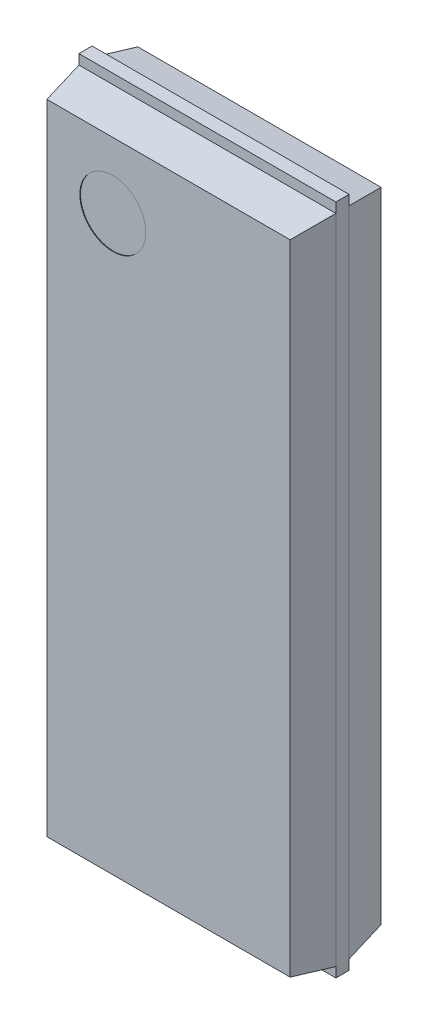
ISO-10303-21;
HEADER;
FILE_DESCRIPTION(('STEP AP214'),'2;1');
FILE_NAME('part.step','',(''),(''),'','','');
FILE_SCHEMA(('AUTOMOTIVE_DESIGN { 1 0 10303 214 1 1 1 1 }'));
ENDSEC;
DATA;
#1=APPLICATION_CONTEXT('core data for automotive mechanical design processes');
#2=APPLICATION_PROTOCOL_DEFINITION('international standard','automotive_design',2000,#1);
#3=PRODUCT_CONTEXT('',#1,'mechanical');
#4=PRODUCT('Part','Part','',(#3));
#5=PRODUCT_RELATED_PRODUCT_CATEGORY('part','',(#4));
#6=PRODUCT_DEFINITION_FORMATION('','',#4);
#7=PRODUCT_DEFINITION_CONTEXT('part definition',#1,'design');
#8=PRODUCT_DEFINITION('design','',#6,#7);
#9=PRODUCT_DEFINITION_SHAPE('','',#8);
#10=(LENGTH_UNIT() NAMED_UNIT(*) SI_UNIT(.MILLI.,.METRE.));
#11=(NAMED_UNIT(*) PLANE_ANGLE_UNIT() SI_UNIT($,.RADIAN.));
#12=(NAMED_UNIT(*) SI_UNIT($,.STERADIAN.) SOLID_ANGLE_UNIT());
#13=UNCERTAINTY_MEASURE_WITH_UNIT(LENGTH_MEASURE(1.E-05),#10,'distance_accuracy_value','');
#14=(GEOMETRIC_REPRESENTATION_CONTEXT(3) GLOBAL_UNCERTAINTY_ASSIGNED_CONTEXT((#13)) GLOBAL_UNIT_ASSIGNED_CONTEXT((#10,
#11,#12)) REPRESENTATION_CONTEXT('',''));
#15=CARTESIAN_POINT('',(0.,0.,0.));
#16=DIRECTION('',(0.,0.,1.));
#17=DIRECTION('',(1.,0.,0.));
#18=AXIS2_PLACEMENT_3D('',#15,#16,#17);
#19=CARTESIAN_POINT('',(1.95,-5.1,0.77));
#20=DIRECTION('',(0.,-1.,0.));
#21=DIRECTION('',(0.,0.,-1.));
#22=AXIS2_PLACEMENT_3D('',#19,#20,#21);
#23=PLANE('',#22);
#24=DIRECTION('',(0.,0.,1.));
#25=VECTOR('',#24,1.);
#26=CARTESIAN_POINT('',(-1.95,-5.1,0.77));
#27=LINE('',#26,#25);
#28=CARTESIAN_POINT('',(-1.95,-5.1,0.77));
#29=VERTEX_POINT('',#28);
#30=CARTESIAN_POINT('',(-1.95,-5.1,0.97));
#31=VERTEX_POINT('',#30);
#32=EDGE_CURVE('E196',#29,#31,#27,.T.);
#33=ORIENTED_EDGE('',*,*,#32,.F.);
#34=DIRECTION('',(-1.,0.,0.));
#35=VECTOR('',#34,1.);
#36=CARTESIAN_POINT('',(1.95,-5.1,0.77));
#37=LINE('',#36,#35);
#38=CARTESIAN_POINT('',(1.95,-5.1,0.77));
#39=VERTEX_POINT('',#38);
#40=EDGE_CURVE('E26',#39,#29,#37,.T.);
#41=ORIENTED_EDGE('',*,*,#40,.F.);
#42=DIRECTION('',(0.,0.,1.));
#43=VECTOR('',#42,1.);
#44=CARTESIAN_POINT('',(1.95,-5.1,0.77));
#45=LINE('',#44,#43);
#46=CARTESIAN_POINT('',(1.95,-5.1,0.97));
#47=VERTEX_POINT('',#46);
#48=EDGE_CURVE('E265',#39,#47,#45,.T.);
#49=ORIENTED_EDGE('',*,*,#48,.T.);
#50=DIRECTION('',(-1.,0.,0.));
#51=VECTOR('',#50,1.);
#52=CARTESIAN_POINT('',(1.95,-5.1,0.97));
#53=LINE('',#52,#51);
#54=EDGE_CURVE('E11',#47,#31,#53,.T.);
#55=ORIENTED_EDGE('',*,*,#54,.T.);
#56=EDGE_LOOP('',(#33,#41,#49,#55));
#57=FACE_BOUND('',#56,.T.);
#58=ADVANCED_FACE('F16',(#57),#23,.T.);
#59=CARTESIAN_POINT('',(1.95,-5.1,0.97));
#60=DIRECTION('',(0.,0.,1.));
#61=DIRECTION('',(1.,0.,0.));
#62=AXIS2_PLACEMENT_3D('',#59,#60,#61);
#63=PLANE('',#62);
#64=DIRECTION('',(0.,1.,0.));
#65=VECTOR('',#64,1.);
#66=CARTESIAN_POINT('',(-1.95,-5.1,0.97));
#67=LINE('',#66,#65);
#68=CARTESIAN_POINT('',(-1.95,-4.95,0.97));
#69=VERTEX_POINT('',#68);
#70=EDGE_CURVE('E168',#31,#69,#67,.T.);
#71=ORIENTED_EDGE('',*,*,#70,.F.);
#72=ORIENTED_EDGE('',*,*,#54,.F.);
#73=DIRECTION('',(0.,1.,0.));
#74=VECTOR('',#73,1.);
#75=CARTESIAN_POINT('',(1.95,-5.1,0.97));
#76=LINE('',#75,#74);
#77=CARTESIAN_POINT('',(1.95,-4.95,0.97));
#78=VERTEX_POINT('',#77);
#79=EDGE_CURVE('E171',#47,#78,#76,.T.);
#80=ORIENTED_EDGE('',*,*,#79,.T.);
#81=DIRECTION('',(-1.,0.,0.));
#82=VECTOR('',#81,1.);
#83=CARTESIAN_POINT('',(-1.95,-4.95,0.97));
#84=LINE('',#83,#82);
#85=EDGE_CURVE('E164',#78,#69,#84,.T.);
#86=ORIENTED_EDGE('',*,*,#85,.T.);
#87=EDGE_LOOP('',(#71,#72,#80,#86));
#88=FACE_BOUND('',#87,.T.);
#89=ADVANCED_FACE('F166',(#88),#63,.T.);
#90=CARTESIAN_POINT('',(1.95,-5.1,0.77));
#91=DIRECTION('',(0.,0.,1.));
#92=DIRECTION('',(1.,0.,0.));
#93=AXIS2_PLACEMENT_3D('',#90,#91,#92);
#94=PLANE('',#93);
#95=DIRECTION('',(0.,1.,0.));
#96=VECTOR('',#95,1.);
#97=CARTESIAN_POINT('',(-1.95,-5.1,0.77));
#98=LINE('',#97,#96);
#99=CARTESIAN_POINT('',(-1.95,-4.95,0.77));
#100=VERTEX_POINT('',#99);
#101=EDGE_CURVE('E287',#29,#100,#98,.T.);
#102=ORIENTED_EDGE('',*,*,#101,.T.);
#103=DIRECTION('',(1.,0.,0.));
#104=VECTOR('',#103,1.);
#105=CARTESIAN_POINT('',(1.95,-4.95,0.77));
#106=LINE('',#105,#104);
#107=CARTESIAN_POINT('',(1.95,-4.95,0.77));
#108=VERTEX_POINT('',#107);
#109=EDGE_CURVE('E221',#100,#108,#106,.T.);
#110=ORIENTED_EDGE('',*,*,#109,.T.);
#111=DIRECTION('',(0.,1.,0.));
#112=VECTOR('',#111,1.);
#113=CARTESIAN_POINT('',(1.95,-5.1,0.77));
#114=LINE('',#113,#112);
#115=EDGE_CURVE('E217',#39,#108,#114,.T.);
#116=ORIENTED_EDGE('',*,*,#115,.F.);
#117=ORIENTED_EDGE('',*,*,#40,.T.);
#118=EDGE_LOOP('',(#102,#110,#116,#117));
#119=FACE_BOUND('',#118,.T.);
#120=ADVANCED_FACE('F334',(#119),#94,.F.);
#121=CARTESIAN_POINT('',(1.95,5.1,0.97));
#122=DIRECTION('',(0.,0.,-1.));
#123=DIRECTION('',(0.,-1.,0.));
#124=AXIS2_PLACEMENT_3D('',#121,#122,#123);
#125=PLANE('',#124);
#126=DIRECTION('',(0.,-1.,0.));
#127=VECTOR('',#126,1.);
#128=CARTESIAN_POINT('',(-1.95,5.1,0.97));
#129=LINE('',#128,#127);
#130=CARTESIAN_POINT('',(-1.95,5.1,0.97));
#131=VERTEX_POINT('',#130);
#132=CARTESIAN_POINT('',(-1.95,4.95,0.97));
#133=VERTEX_POINT('',#132);
#134=EDGE_CURVE('E205',#131,#133,#129,.T.);
#135=ORIENTED_EDGE('',*,*,#134,.T.);
#136=DIRECTION('',(1.,0.,0.));
#137=VECTOR('',#136,1.);
#138=CARTESIAN_POINT('',(1.95,4.95,0.97));
#139=LINE('',#138,#137);
#140=CARTESIAN_POINT('',(1.95,4.95,0.97));
#141=VERTEX_POINT('',#140);
#142=EDGE_CURVE('E235',#133,#141,#139,.T.);
#143=ORIENTED_EDGE('',*,*,#142,.T.);
#144=DIRECTION('',(0.,-1.,0.));
#145=VECTOR('',#144,1.);
#146=CARTESIAN_POINT('',(1.95,5.1,0.97));
#147=LINE('',#146,#145);
#148=CARTESIAN_POINT('',(1.95,5.1,0.97));
#149=VERTEX_POINT('',#148);
#150=EDGE_CURVE('E243',#149,#141,#147,.T.);
#151=ORIENTED_EDGE('',*,*,#150,.F.);
#152=DIRECTION('',(-1.,0.,0.));
#153=VECTOR('',#152,1.);
#154=CARTESIAN_POINT('',(1.95,5.1,0.97));
#155=LINE('',#154,#153);
#156=EDGE_CURVE('E234',#149,#131,#155,.T.);
#157=ORIENTED_EDGE('',*,*,#156,.T.);
#158=EDGE_LOOP('',(#135,#143,#151,#157));
#159=FACE_BOUND('',#158,.T.);
#160=ADVANCED_FACE('F366',(#159),#125,.F.);
#161=CARTESIAN_POINT('',(1.95,5.1,0.77));
#162=DIRECTION('',(0.,-1.,0.));
#163=DIRECTION('',(0.,0.,-1.));
#164=AXIS2_PLACEMENT_3D('',#161,#162,#163);
#165=PLANE('',#164);
#166=DIRECTION('',(0.,0.,1.));
#167=VECTOR('',#166,1.);
#168=CARTESIAN_POINT('',(-1.95,5.1,0.77));
#169=LINE('',#168,#167);
#170=CARTESIAN_POINT('',(-1.95,5.1,0.77));
#171=VERTEX_POINT('',#170);
#172=EDGE_CURVE('E212',#171,#131,#169,.T.);
#173=ORIENTED_EDGE('',*,*,#172,.T.);
#174=ORIENTED_EDGE('',*,*,#156,.F.);
#175=DIRECTION('',(0.,0.,1.));
#176=VECTOR('',#175,1.);
#177=CARTESIAN_POINT('',(1.95,5.1,0.77));
#178=LINE('',#177,#176);
#179=CARTESIAN_POINT('',(1.95,5.1,0.77));
#180=VERTEX_POINT('',#179);
#181=EDGE_CURVE('E248',#180,#149,#178,.T.);
#182=ORIENTED_EDGE('',*,*,#181,.F.);
#183=DIRECTION('',(-1.,0.,0.));
#184=VECTOR('',#183,1.);
#185=CARTESIAN_POINT('',(1.95,5.1,0.77));
#186=LINE('',#185,#184);
#187=EDGE_CURVE('E113',#180,#171,#186,.T.);
#188=ORIENTED_EDGE('',*,*,#187,.T.);
#189=EDGE_LOOP('',(#173,#174,#182,#188));
#190=FACE_BOUND('',#189,.T.);
#191=ADVANCED_FACE('F421',(#190),#165,.F.);
#192=CARTESIAN_POINT('',(1.95,5.1,0.77));
#193=DIRECTION('',(0.,0.,-1.));
#194=DIRECTION('',(0.,-1.,0.));
#195=AXIS2_PLACEMENT_3D('',#192,#193,#194);
#196=PLANE('',#195);
#197=DIRECTION('',(0.,-1.,0.));
#198=VECTOR('',#197,1.);
#199=CARTESIAN_POINT('',(-1.95,5.1,0.77));
#200=LINE('',#199,#198);
#201=CARTESIAN_POINT('',(-1.95,4.95,0.77));
#202=VERTEX_POINT('',#201);
#203=EDGE_CURVE('E231',#171,#202,#200,.T.);
#204=ORIENTED_EDGE('',*,*,#203,.F.);
#205=ORIENTED_EDGE('',*,*,#187,.F.);
#206=DIRECTION('',(0.,-1.,0.));
#207=VECTOR('',#206,1.);
#208=CARTESIAN_POINT('',(1.95,5.1,0.77));
#209=LINE('',#208,#207);
#210=CARTESIAN_POINT('',(1.95,4.95,0.77));
#211=VERTEX_POINT('',#210);
#212=EDGE_CURVE('E271',#180,#211,#209,.T.);
#213=ORIENTED_EDGE('',*,*,#212,.T.);
#214=DIRECTION('',(-1.,0.,0.));
#215=VECTOR('',#214,1.);
#216=CARTESIAN_POINT('',(1.95,4.95,0.77));
#217=LINE('',#216,#215);
#218=EDGE_CURVE('E122',#211,#202,#217,.T.);
#219=ORIENTED_EDGE('',*,*,#218,.T.);
#220=EDGE_LOOP('',(#204,#205,#213,#219));
#221=FACE_BOUND('',#220,.T.);
#222=ADVANCED_FACE('F346',(#221),#196,.T.);
#223=CARTESIAN_POINT('',(-0.845967081382,3.845967081382,1.55));
#224=DIRECTION('',(0.,0.,1.));
#225=DIRECTION('',(1.,0.,0.));
#226=AXIS2_PLACEMENT_3D('',#223,#224,#225);
#227=PLANE('',#226);
#228=CARTESIAN_POINT('',(-0.845967081382,3.845967081382,1.55));
#229=DIRECTION('',(0.,0.,1.));
#230=DIRECTION('',(0.,-1.,0.));
#231=AXIS2_PLACEMENT_3D('',#228,#229,#230);
#232=CIRCLE('',#231,0.5);
#233=CARTESIAN_POINT('',(-0.845967081382,3.345967081382,1.55));
#234=VERTEX_POINT('',#233);
#235=CARTESIAN_POINT('',(-0.845967081382,4.345967081382,1.55));
#236=VERTEX_POINT('',#235);
#237=EDGE_CURVE('E236',#234,#236,#232,.T.);
#238=ORIENTED_EDGE('',*,*,#237,.T.);
#239=CARTESIAN_POINT('',(-0.845967081382,3.845967081382,1.55));
#240=DIRECTION('',(0.,0.,1.));
#241=DIRECTION('',(0.,-1.,0.));
#242=AXIS2_PLACEMENT_3D('',#239,#240,#241);
#243=CIRCLE('',#242,0.5);
#244=EDGE_CURVE('E143',#236,#234,#243,.T.);
#245=ORIENTED_EDGE('',*,*,#244,.T.);
#246=EDGE_LOOP('',(#238,#245));
#247=FACE_BOUND('',#246,.T.);
#248=ADVANCED_FACE('F400',(#247),#227,.T.);
#249=CARTESIAN_POINT('',(0.,4.845967081382,1.56));
#250=DIRECTION('',(0.,0.98480775301219,0.173648177667033));
#251=DIRECTION('',(1.,0.,0.));
#252=AXIS2_PLACEMENT_3D('',#249,#250,#251);
#253=PLANE('',#252);
#254=DIRECTION('',(0.171087869745971,0.171087869745971,-0.970287525247837));
#255=VECTOR('',#254,1.);
#256=CARTESIAN_POINT('',(1.704120492186,4.704120492186,2.364451982479));
#257=LINE('',#256,#255);
#258=CARTESIAN_POINT('',(1.845967081382,4.845967081382,1.56));
#259=VERTEX_POINT('',#258);
#260=EDGE_CURVE('E242',#259,#141,#257,.T.);
#261=ORIENTED_EDGE('',*,*,#260,.T.);
#262=ORIENTED_EDGE('',*,*,#142,.F.);
#263=DIRECTION('',(0.171087869745971,-0.171087869745971,0.970287525247837));
#264=VECTOR('',#263,1.);
#265=CARTESIAN_POINT('',(-1.704120492186,4.704120492186,2.364451982479));
#266=LINE('',#265,#264);
#267=CARTESIAN_POINT('',(-1.845967081382,4.845967081382,1.56));
#268=VERTEX_POINT('',#267);
#269=EDGE_CURVE('E202',#133,#268,#266,.T.);
#270=ORIENTED_EDGE('',*,*,#269,.T.);
#271=DIRECTION('',(-1.,0.,0.));
#272=VECTOR('',#271,1.);
#273=CARTESIAN_POINT('',(-1.95,4.845967081382,1.56));
#274=LINE('',#273,#272);
#275=EDGE_CURVE('E281',#259,#268,#274,.T.);
#276=ORIENTED_EDGE('',*,*,#275,.F.);
#277=EDGE_LOOP('',(#261,#262,#270,#276));
#278=FACE_BOUND('',#277,.T.);
#279=ADVANCED_FACE('F369',(#278),#253,.T.);
#280=CARTESIAN_POINT('',(-1.845967081382,0.,1.56));
#281=DIRECTION('',(-0.98480775301219,0.,0.173648177667033));
#282=DIRECTION('',(0.,1.,0.));
#283=AXIS2_PLACEMENT_3D('',#280,#281,#282);
#284=PLANE('',#283);
#285=DIRECTION('',(0.171087869745971,0.171087869745971,0.970287525247837));
#286=VECTOR('',#285,1.);
#287=CARTESIAN_POINT('',(-1.791933669709,-4.791933669709,1.866438705272));
#288=LINE('',#287,#286);
#289=CARTESIAN_POINT('',(-1.845967081382,-4.845967081382,1.56));
#290=VERTEX_POINT('',#289);
#291=EDGE_CURVE('E176',#69,#290,#288,.T.);
#292=ORIENTED_EDGE('',*,*,#291,.T.);
#293=DIRECTION('',(0.,-1.,0.));
#294=VECTOR('',#293,1.);
#295=CARTESIAN_POINT('',(-1.845967081382,-4.95,1.56));
#296=LINE('',#295,#294);
#297=EDGE_CURVE('E317',#268,#290,#296,.T.);
#298=ORIENTED_EDGE('',*,*,#297,.F.);
#299=ORIENTED_EDGE('',*,*,#269,.F.);
#300=DIRECTION('',(0.,1.,0.));
#301=VECTOR('',#300,1.);
#302=CARTESIAN_POINT('',(-1.95,4.95,0.97));
#303=LINE('',#302,#301);
#304=EDGE_CURVE('E193',#69,#133,#303,.T.);
#305=ORIENTED_EDGE('',*,*,#304,.F.);
#306=EDGE_LOOP('',(#292,#298,#299,#305));
#307=FACE_BOUND('',#306,.T.);
#308=ADVANCED_FACE('F201',(#307),#284,.T.);
#309=CARTESIAN_POINT('',(1.845967081382,0.,1.56));
#310=DIRECTION('',(0.98480775301219,0.,0.173648177667033));
#311=DIRECTION('',(0.,-1.,0.));
#312=AXIS2_PLACEMENT_3D('',#309,#310,#311);
#313=PLANE('',#312);
#314=DIRECTION('',(0.171087869745971,-0.171087869745971,-0.970287525247837));
#315=VECTOR('',#314,1.);
#316=CARTESIAN_POINT('',(1.704120492186,-4.704120492186,2.364451982479));
#317=LINE('',#316,#315);
#318=CARTESIAN_POINT('',(1.845967081382,-4.845967081382,1.56));
#319=VERTEX_POINT('',#318);
#320=EDGE_CURVE('E175',#319,#78,#317,.T.);
#321=ORIENTED_EDGE('',*,*,#320,.T.);
#322=DIRECTION('',(0.,-1.,0.));
#323=VECTOR('',#322,1.);
#324=CARTESIAN_POINT('',(1.95,-4.95,0.97));
#325=LINE('',#324,#323);
#326=EDGE_CURVE('E198',#141,#78,#325,.T.);
#327=ORIENTED_EDGE('',*,*,#326,.F.);
#328=ORIENTED_EDGE('',*,*,#260,.F.);
#329=DIRECTION('',(0.,1.,0.));
#330=VECTOR('',#329,1.);
#331=CARTESIAN_POINT('',(1.845967081382,4.95,1.56));
#332=LINE('',#331,#330);
#333=EDGE_CURVE('E247',#319,#259,#332,.T.);
#334=ORIENTED_EDGE('',*,*,#333,.F.);
#335=EDGE_LOOP('',(#321,#327,#328,#334));
#336=FACE_BOUND('',#335,.T.);
#337=ADVANCED_FACE('F372',(#336),#313,.T.);
#338=CARTESIAN_POINT('',(0.,-4.845967081382,1.56));
#339=DIRECTION('',(0.,-0.98480775301219,0.173648177667033));
#340=DIRECTION('',(-1.,0.,0.));
#341=AXIS2_PLACEMENT_3D('',#338,#339,#340);
#342=PLANE('',#341);
#343=ORIENTED_EDGE('',*,*,#291,.F.);
#344=ORIENTED_EDGE('',*,*,#85,.F.);
#345=ORIENTED_EDGE('',*,*,#320,.F.);
#346=DIRECTION('',(1.,0.,0.));
#347=VECTOR('',#346,1.);
#348=CARTESIAN_POINT('',(1.95,-4.845967081382,1.56));
#349=LINE('',#348,#347);
#350=EDGE_CURVE('E181',#290,#319,#349,.T.);
#351=ORIENTED_EDGE('',*,*,#350,.F.);
#352=EDGE_LOOP('',(#343,#344,#345,#351));
#353=FACE_BOUND('',#352,.T.);
#354=ADVANCED_FACE('F179',(#353),#342,.T.);
#355=CARTESIAN_POINT('',(-1.95,4.95,0.77));
#356=DIRECTION('',(0.98480775301219,0.,0.173648177667033));
#357=DIRECTION('',(0.,-1.,0.));
#358=AXIS2_PLACEMENT_3D('',#355,#356,#357);
#359=PLANE('',#358);
#360=DIRECTION('',(0.171087869745971,-0.171087869745971,-0.970287525247837));
#361=VECTOR('',#360,1.);
#362=CARTESIAN_POINT('',(-1.83584286922,4.83584286922,0.12258273963));
#363=LINE('',#362,#361);
#364=CARTESIAN_POINT('',(-1.845967081382,4.845967081382,0.18));
#365=VERTEX_POINT('',#364);
#366=EDGE_CURVE('E222',#202,#365,#363,.T.);
#367=ORIENTED_EDGE('',*,*,#366,.T.);
#368=DIRECTION('',(0.,1.,0.));
#369=VECTOR('',#368,1.);
#370=CARTESIAN_POINT('',(-1.845967081382,0.,0.18));
#371=LINE('',#370,#369);
#372=CARTESIAN_POINT('',(-1.845967081382,-4.845967081382,0.18));
#373=VERTEX_POINT('',#372);
#374=EDGE_CURVE('E227',#373,#365,#371,.T.);
#375=ORIENTED_EDGE('',*,*,#374,.F.);
#376=DIRECTION('',(-0.171087869745971,-0.171087869745971,0.970287525247837));
#377=VECTOR('',#376,1.);
#378=CARTESIAN_POINT('',(-1.83584286922,-4.83584286922,0.12258273963));
#379=LINE('',#378,#377);
#380=EDGE_CURVE('E187',#373,#100,#379,.T.);
#381=ORIENTED_EDGE('',*,*,#380,.T.);
#382=DIRECTION('',(0.,-1.,0.));
#383=VECTOR('',#382,1.);
#384=CARTESIAN_POINT('',(-1.95,4.95,0.77));
#385=LINE('',#384,#383);
#386=EDGE_CURVE('E291',#202,#100,#385,.T.);
#387=ORIENTED_EDGE('',*,*,#386,.F.);
#388=EDGE_LOOP('',(#367,#375,#381,#387));
#389=FACE_BOUND('',#388,.T.);
#390=ADVANCED_FACE('F413',(#389),#359,.F.);
#391=CARTESIAN_POINT('',(1.95,-4.95,0.77));
#392=DIRECTION('',(0.,0.98480775301219,0.173648177667033));
#393=DIRECTION('',(1.,0.,0.));
#394=AXIS2_PLACEMENT_3D('',#391,#392,#393);
#395=PLANE('',#394);
#396=DIRECTION('',(0.171087869745971,-0.171087869745971,0.970287525247837));
#397=VECTOR('',#396,1.);
#398=CARTESIAN_POINT('',(1.660216514175,-4.660216514175,-0.873443814784));
#399=LINE('',#398,#397);
#400=CARTESIAN_POINT('',(1.845967081382,-4.845967081382,0.18));
#401=VERTEX_POINT('',#400);
#402=EDGE_CURVE('E285',#401,#108,#399,.T.);
#403=ORIENTED_EDGE('',*,*,#402,.T.);
#404=ORIENTED_EDGE('',*,*,#109,.F.);
#405=ORIENTED_EDGE('',*,*,#380,.F.);
#406=DIRECTION('',(-1.,0.,0.));
#407=VECTOR('',#406,1.);
#408=CARTESIAN_POINT('',(0.,-4.845967081382,0.18));
#409=LINE('',#408,#407);
#410=EDGE_CURVE('E223',#401,#373,#409,.T.);
#411=ORIENTED_EDGE('',*,*,#410,.F.);
#412=EDGE_LOOP('',(#403,#404,#405,#411));
#413=FACE_BOUND('',#412,.T.);
#414=ADVANCED_FACE('F339',(#413),#395,.F.);
#415=CARTESIAN_POINT('',(1.95,4.95,0.77));
#416=DIRECTION('',(0.,-0.98480775301219,0.173648177667033));
#417=DIRECTION('',(-1.,0.,0.));
#418=AXIS2_PLACEMENT_3D('',#415,#416,#417);
#419=PLANE('',#418);
#420=DIRECTION('',(-0.171087869745971,-0.171087869745971,-0.970287525247837));
#421=VECTOR('',#420,1.);
#422=CARTESIAN_POINT('',(1.95,4.95,0.77));
#423=LINE('',#422,#421);
#424=CARTESIAN_POINT('',(1.845967081382,4.845967081382,0.18));
#425=VERTEX_POINT('',#424);
#426=EDGE_CURVE('E39',#211,#425,#423,.T.);
#427=ORIENTED_EDGE('',*,*,#426,.T.);
#428=DIRECTION('',(1.,0.,0.));
#429=VECTOR('',#428,1.);
#430=CARTESIAN_POINT('',(0.,4.845967081382,0.18));
#431=LINE('',#430,#429);
#432=EDGE_CURVE('E259',#365,#425,#431,.T.);
#433=ORIENTED_EDGE('',*,*,#432,.F.);
#434=ORIENTED_EDGE('',*,*,#366,.F.);
#435=ORIENTED_EDGE('',*,*,#218,.F.);
#436=EDGE_LOOP('',(#427,#433,#434,#435));
#437=FACE_BOUND('',#436,.T.);
#438=ADVANCED_FACE('F397',(#437),#419,.F.);
#439=CARTESIAN_POINT('',(1.95,4.95,0.77));
#440=DIRECTION('',(-0.98480775301219,0.,0.173648177667033));
#441=DIRECTION('',(0.,1.,0.));
#442=AXIS2_PLACEMENT_3D('',#439,#440,#441);
#443=PLANE('',#442);
#444=ORIENTED_EDGE('',*,*,#402,.F.);
#445=DIRECTION('',(0.,-1.,0.));
#446=VECTOR('',#445,1.);
#447=CARTESIAN_POINT('',(1.845967081382,0.,0.18));
#448=LINE('',#447,#446);
#449=EDGE_CURVE('E282',#425,#401,#448,.T.);
#450=ORIENTED_EDGE('',*,*,#449,.F.);
#451=ORIENTED_EDGE('',*,*,#426,.F.);
#452=DIRECTION('',(0.,1.,0.));
#453=VECTOR('',#452,1.);
#454=CARTESIAN_POINT('',(1.95,4.95,0.77));
#455=LINE('',#454,#453);
#456=EDGE_CURVE('E274',#108,#211,#455,.T.);
#457=ORIENTED_EDGE('',*,*,#456,.F.);
#458=EDGE_LOOP('',(#444,#450,#451,#457));
#459=FACE_BOUND('',#458,.T.);
#460=ADVANCED_FACE('F343',(#459),#443,.F.);
#461=CARTESIAN_POINT('',(0.,0.,0.18));
#462=DIRECTION('',(0.,0.,1.));
#463=DIRECTION('',(1.,0.,0.));
#464=AXIS2_PLACEMENT_3D('',#461,#462,#463);
#465=PLANE('',#464);
#466=ORIENTED_EDGE('',*,*,#410,.T.);
#467=ORIENTED_EDGE('',*,*,#374,.T.);
#468=ORIENTED_EDGE('',*,*,#432,.T.);
#469=ORIENTED_EDGE('',*,*,#449,.T.);
#470=EDGE_LOOP('',(#466,#467,#468,#469));
#471=FACE_BOUND('',#470,.T.);
#472=ADVANCED_FACE('F376',(#471),#465,.F.);
#473=CARTESIAN_POINT('',(0.,0.,1.56));
#474=DIRECTION('',(0.,0.,1.));
#475=DIRECTION('',(1.,0.,0.));
#476=AXIS2_PLACEMENT_3D('',#473,#474,#475);
#477=PLANE('',#476);
#478=CARTESIAN_POINT('',(-0.845967081382,3.845967081382,1.56));
#479=DIRECTION('',(0.,0.,1.));
#480=DIRECTION('',(0.,-1.,0.));
#481=AXIS2_PLACEMENT_3D('',#478,#479,#480);
#482=CIRCLE('',#481,0.5);
#483=CARTESIAN_POINT('',(-0.845967081382,3.345967081382,1.56));
#484=VERTEX_POINT('',#483);
#485=CARTESIAN_POINT('',(-0.845967081382,4.345967081382,1.56));
#486=VERTEX_POINT('',#485);
#487=EDGE_CURVE('E249',#484,#486,#482,.T.);
#488=ORIENTED_EDGE('',*,*,#487,.F.);
#489=CARTESIAN_POINT('',(-0.845967081382,3.845967081382,1.56));
#490=DIRECTION('',(0.,0.,1.));
#491=DIRECTION('',(0.,-1.,0.));
#492=AXIS2_PLACEMENT_3D('',#489,#490,#491);
#493=CIRCLE('',#492,0.5);
#494=EDGE_CURVE('E133',#486,#484,#493,.T.);
#495=ORIENTED_EDGE('',*,*,#494,.F.);
#496=EDGE_LOOP('',(#488,#495));
#497=FACE_BOUND('',#496,.T.);
#498=ORIENTED_EDGE('',*,*,#333,.T.);
#499=ORIENTED_EDGE('',*,*,#275,.T.);
#500=ORIENTED_EDGE('',*,*,#297,.T.);
#501=ORIENTED_EDGE('',*,*,#350,.T.);
#502=EDGE_LOOP('',(#498,#499,#500,#501));
#503=FACE_BOUND('',#502,.T.);
#504=ADVANCED_FACE('F374',(#497,#503),#477,.T.);
#505=CARTESIAN_POINT('',(1.95,4.95,1.56));
#506=DIRECTION('',(-1.,0.,0.));
#507=DIRECTION('',(0.,1.,0.));
#508=AXIS2_PLACEMENT_3D('',#505,#506,#507);
#509=PLANE('',#508);
#510=ORIENTED_EDGE('',*,*,#326,.T.);
#511=ORIENTED_EDGE('',*,*,#79,.F.);
#512=ORIENTED_EDGE('',*,*,#48,.F.);
#513=ORIENTED_EDGE('',*,*,#115,.T.);
#514=ORIENTED_EDGE('',*,*,#456,.T.);
#515=ORIENTED_EDGE('',*,*,#212,.F.);
#516=ORIENTED_EDGE('',*,*,#181,.T.);
#517=ORIENTED_EDGE('',*,*,#150,.T.);
#518=EDGE_LOOP('',(#510,#511,#512,#513,#514,#515,#516,#517));
#519=FACE_BOUND('',#518,.T.);
#520=ADVANCED_FACE('F332',(#519),#509,.F.);
#521=CARTESIAN_POINT('',(-1.95,4.95,1.56));
#522=DIRECTION('',(1.,0.,0.));
#523=DIRECTION('',(0.,1.,0.));
#524=AXIS2_PLACEMENT_3D('',#521,#522,#523);
#525=PLANE('',#524);
#526=ORIENTED_EDGE('',*,*,#304,.T.);
#527=ORIENTED_EDGE('',*,*,#134,.F.);
#528=ORIENTED_EDGE('',*,*,#172,.F.);
#529=ORIENTED_EDGE('',*,*,#203,.T.);
#530=ORIENTED_EDGE('',*,*,#386,.T.);
#531=ORIENTED_EDGE('',*,*,#101,.F.);
#532=ORIENTED_EDGE('',*,*,#32,.T.);
#533=ORIENTED_EDGE('',*,*,#70,.T.);
#534=EDGE_LOOP('',(#526,#527,#528,#529,#530,#531,#532,#533));
#535=FACE_BOUND('',#534,.T.);
#536=ADVANCED_FACE('F191',(#535),#525,.F.);
#537=CARTESIAN_POINT('',(-0.845967081382,3.845967081382,1.55));
#538=DIRECTION('',(0.,0.,-1.));
#539=DIRECTION('',(0.,-1.,0.));
#540=AXIS2_PLACEMENT_3D('',#537,#538,#539);
#541=CYLINDRICAL_SURFACE('',#540,0.5);
#542=DIRECTION('',(0.,0.,-1.));
#543=VECTOR('',#542,1.);
#544=CARTESIAN_POINT('',(-0.845967081382,3.345967081382,1.55));
#545=LINE('',#544,#543);
#546=EDGE_CURVE('E253',#484,#234,#545,.T.);
#547=ORIENTED_EDGE('',*,*,#546,.T.);
#548=ORIENTED_EDGE('',*,*,#244,.F.);
#549=DIRECTION('',(0.,0.,1.));
#550=VECTOR('',#549,1.);
#551=CARTESIAN_POINT('',(-0.845967081382,4.345967081382,1.55));
#552=LINE('',#551,#550);
#553=EDGE_CURVE('E239',#236,#486,#552,.T.);
#554=ORIENTED_EDGE('',*,*,#553,.T.);
#555=ORIENTED_EDGE('',*,*,#494,.T.);
#556=EDGE_LOOP('',(#547,#548,#554,#555));
#557=FACE_BOUND('',#556,.T.);
#558=ADVANCED_FACE('F403',(#557),#541,.F.);
#559=CARTESIAN_POINT('',(-0.845967081382,3.845967081382,1.55));
#560=DIRECTION('',(0.,0.,-1.));
#561=DIRECTION('',(0.,-1.,0.));
#562=AXIS2_PLACEMENT_3D('',#559,#560,#561);
#563=CYLINDRICAL_SURFACE('',#562,0.5);
#564=ORIENTED_EDGE('',*,*,#546,.F.);
#565=ORIENTED_EDGE('',*,*,#487,.T.);
#566=ORIENTED_EDGE('',*,*,#553,.F.);
#567=ORIENTED_EDGE('',*,*,#237,.F.);
#568=EDGE_LOOP('',(#564,#565,#566,#567));
#569=FACE_BOUND('',#568,.T.);
#570=ADVANCED_FACE('F18',(#569),#563,.F.);
#571=CLOSED_SHELL('',(#58,#89,#120,#160,#191,#222,#248,#279,#308,#337,#354,#390,#414,#438,#460,
#472,#504,#520,#536,#558,#570));
#572=MANIFOLD_SOLID_BREP('B1',#571);
#573=ADVANCED_BREP_SHAPE_REPRESENTATION('',(#18,#572),#14);
#574=SHAPE_DEFINITION_REPRESENTATION(#9,#573);
ENDSEC;
END-ISO-10303-21;
